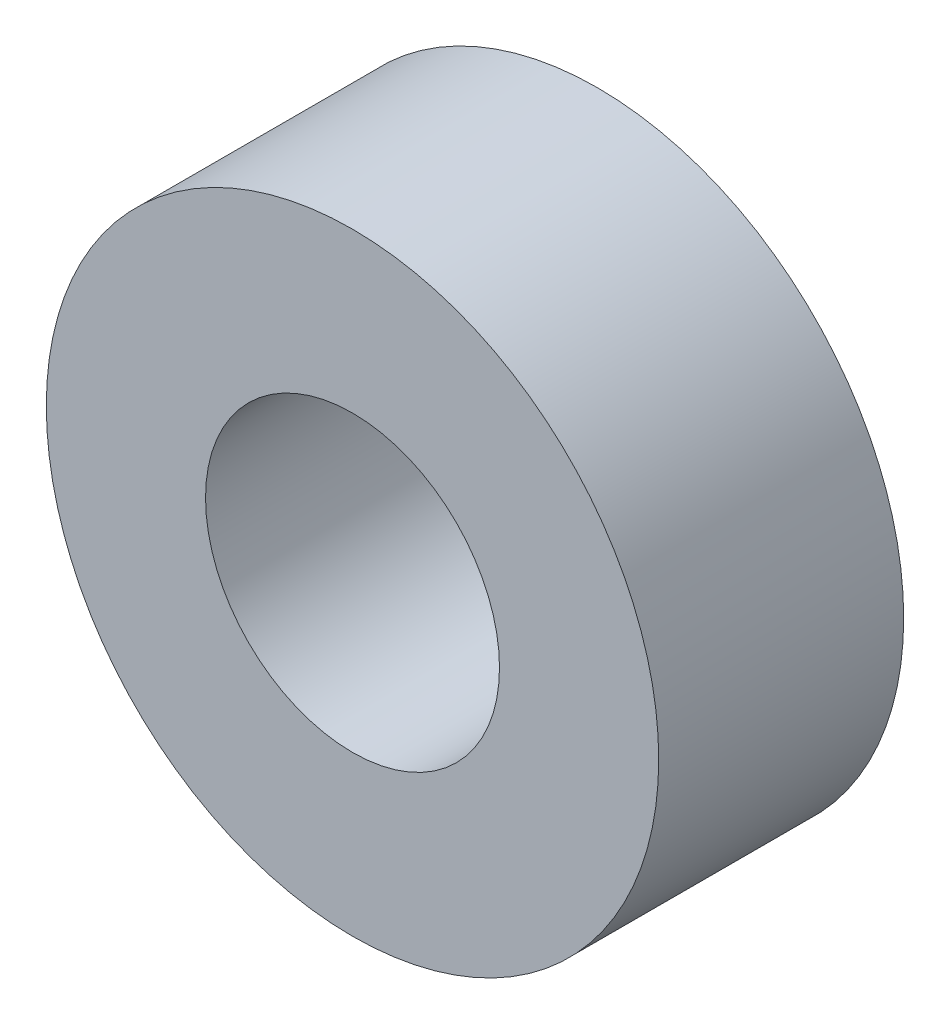
ISO-10303-21;
HEADER;
FILE_DESCRIPTION(('STEP AP214'),'2;1');
FILE_NAME('part.step','',(''),(''),'','','');
FILE_SCHEMA(('AUTOMOTIVE_DESIGN { 1 0 10303 214 1 1 1 1 }'));
ENDSEC;
DATA;
#1=APPLICATION_CONTEXT('core data for automotive mechanical design processes');
#2=APPLICATION_PROTOCOL_DEFINITION('international standard','automotive_design',2000,#1);
#3=PRODUCT_CONTEXT('',#1,'mechanical');
#4=PRODUCT('Part','Part','',(#3));
#5=PRODUCT_RELATED_PRODUCT_CATEGORY('part','',(#4));
#6=PRODUCT_DEFINITION_FORMATION('','',#4);
#7=PRODUCT_DEFINITION_CONTEXT('part definition',#1,'design');
#8=PRODUCT_DEFINITION('design','',#6,#7);
#9=PRODUCT_DEFINITION_SHAPE('','',#8);
#10=(LENGTH_UNIT() NAMED_UNIT(*) SI_UNIT(.MILLI.,.METRE.));
#11=(NAMED_UNIT(*) PLANE_ANGLE_UNIT() SI_UNIT($,.RADIAN.));
#12=(NAMED_UNIT(*) SI_UNIT($,.STERADIAN.) SOLID_ANGLE_UNIT());
#13=UNCERTAINTY_MEASURE_WITH_UNIT(LENGTH_MEASURE(1.E-05),#10,'distance_accuracy_value','');
#14=(GEOMETRIC_REPRESENTATION_CONTEXT(3) GLOBAL_UNCERTAINTY_ASSIGNED_CONTEXT((#13)) GLOBAL_UNIT_ASSIGNED_CONTEXT((#10,
#11,#12)) REPRESENTATION_CONTEXT('',''));
#15=CARTESIAN_POINT('',(0.,0.,0.));
#16=DIRECTION('',(0.,0.,1.));
#17=DIRECTION('',(1.,0.,0.));
#18=AXIS2_PLACEMENT_3D('',#15,#16,#17);
#19=CARTESIAN_POINT('',(12.5087,12.5087,0.00870000000009));
#20=DIRECTION('',(0.,0.,1.));
#21=DIRECTION('',(1.,0.,0.));
#22=AXIS2_PLACEMENT_3D('',#19,#20,#21);
#23=CYLINDRICAL_SURFACE('',#22,6.);
#24=CARTESIAN_POINT('',(12.5087,12.5087,0.00870000000009));
#25=DIRECTION('',(0.,0.,1.));
#26=DIRECTION('',(1.,0.,0.));
#27=AXIS2_PLACEMENT_3D('',#24,#25,#26);
#28=CIRCLE('',#27,6.);
#29=CARTESIAN_POINT('',(18.5087,12.5087,0.00870000000009));
#30=VERTEX_POINT('',#29);
#31=EDGE_CURVE('E25',#30,#30,#28,.F.);
#32=ORIENTED_EDGE('',*,*,#31,.T.);
#33=EDGE_LOOP('',(#32));
#34=FACE_BOUND('',#33,.T.);
#35=CARTESIAN_POINT('',(12.5087,12.5087,10.0087));
#36=DIRECTION('',(0.,0.,1.));
#37=DIRECTION('',(1.,0.,0.));
#38=AXIS2_PLACEMENT_3D('',#35,#36,#37);
#39=CIRCLE('',#38,6.);
#40=CARTESIAN_POINT('',(18.5087,12.5087,10.0087));
#41=VERTEX_POINT('',#40);
#42=EDGE_CURVE('E16',#41,#41,#39,.F.);
#43=ORIENTED_EDGE('',*,*,#42,.F.);
#44=EDGE_LOOP('',(#43));
#45=FACE_BOUND('',#44,.T.);
#46=ADVANCED_FACE('F13',(#34,#45),#23,.F.);
#47=CARTESIAN_POINT('',(12.5087,12.5087,10.0087));
#48=DIRECTION('',(0.,0.,1.));
#49=DIRECTION('',(1.,0.,0.));
#50=AXIS2_PLACEMENT_3D('',#47,#48,#49);
#51=PLANE('',#50);
#52=ORIENTED_EDGE('',*,*,#42,.T.);
#53=EDGE_LOOP('',(#52));
#54=FACE_BOUND('',#53,.T.);
#55=CARTESIAN_POINT('',(12.5087,12.5087,10.0087));
#56=DIRECTION('',(0.,0.,1.));
#57=DIRECTION('',(1.,0.,0.));
#58=AXIS2_PLACEMENT_3D('',#55,#56,#57);
#59=CIRCLE('',#58,12.5);
#60=CARTESIAN_POINT('',(25.0087,12.5087,10.0087));
#61=VERTEX_POINT('',#60);
#62=EDGE_CURVE('E20',#61,#61,#59,.F.);
#63=ORIENTED_EDGE('',*,*,#62,.F.);
#64=EDGE_LOOP('',(#63));
#65=FACE_BOUND('',#64,.T.);
#66=ADVANCED_FACE('F33',(#54,#65),#51,.T.);
#67=CARTESIAN_POINT('',(12.5087,12.5087,0.00870000000009));
#68=DIRECTION('',(0.,0.,1.));
#69=DIRECTION('',(1.,0.,0.));
#70=AXIS2_PLACEMENT_3D('',#67,#68,#69);
#71=PLANE('',#70);
#72=ORIENTED_EDGE('',*,*,#31,.F.);
#73=EDGE_LOOP('',(#72));
#74=FACE_BOUND('',#73,.T.);
#75=CARTESIAN_POINT('',(12.5087,12.5087,0.00870000000009));
#76=DIRECTION('',(0.,0.,1.));
#77=DIRECTION('',(1.,0.,0.));
#78=AXIS2_PLACEMENT_3D('',#75,#76,#77);
#79=CIRCLE('',#78,12.5);
#80=CARTESIAN_POINT('',(25.0087,12.5087,0.00870000000009));
#81=VERTEX_POINT('',#80);
#82=EDGE_CURVE('E8',#81,#81,#79,.T.);
#83=ORIENTED_EDGE('',*,*,#82,.F.);
#84=EDGE_LOOP('',(#83));
#85=FACE_BOUND('',#84,.T.);
#86=ADVANCED_FACE('F41',(#74,#85),#71,.F.);
#87=CARTESIAN_POINT('',(12.5087,12.5087,0.00870000000009));
#88=DIRECTION('',(0.,0.,1.));
#89=DIRECTION('',(1.,0.,0.));
#90=AXIS2_PLACEMENT_3D('',#87,#88,#89);
#91=CYLINDRICAL_SURFACE('',#90,12.5);
#92=ORIENTED_EDGE('',*,*,#82,.T.);
#93=EDGE_LOOP('',(#92));
#94=FACE_BOUND('',#93,.T.);
#95=ORIENTED_EDGE('',*,*,#62,.T.);
#96=EDGE_LOOP('',(#95));
#97=FACE_BOUND('',#96,.T.);
#98=ADVANCED_FACE('F42',(#94,#97),#91,.T.);
#99=CLOSED_SHELL('',(#46,#66,#86,#98));
#100=MANIFOLD_SOLID_BREP('B1',#99);
#101=ADVANCED_BREP_SHAPE_REPRESENTATION('',(#18,#100),#14);
#102=SHAPE_DEFINITION_REPRESENTATION(#9,#101);
ENDSEC;
END-ISO-10303-21;
